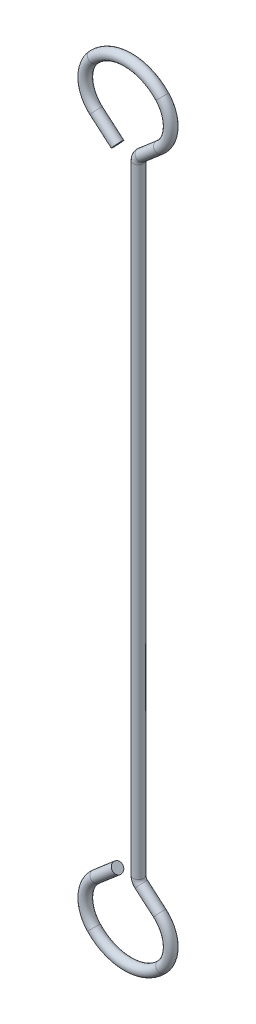
ISO-10303-21;
HEADER;
FILE_DESCRIPTION(('STEP AP214'),'2;1');
FILE_NAME('part.step','',(''),(''),'','','');
FILE_SCHEMA(('AUTOMOTIVE_DESIGN { 1 0 10303 214 1 1 1 1 }'));
ENDSEC;
DATA;
#1=APPLICATION_CONTEXT('core data for automotive mechanical design processes');
#2=APPLICATION_PROTOCOL_DEFINITION('international standard','automotive_design',2000,#1);
#3=PRODUCT_CONTEXT('',#1,'mechanical');
#4=PRODUCT('Part','Part','',(#3));
#5=PRODUCT_RELATED_PRODUCT_CATEGORY('part','',(#4));
#6=PRODUCT_DEFINITION_FORMATION('','',#4);
#7=PRODUCT_DEFINITION_CONTEXT('part definition',#1,'design');
#8=PRODUCT_DEFINITION('design','',#6,#7);
#9=PRODUCT_DEFINITION_SHAPE('','',#8);
#10=(LENGTH_UNIT() NAMED_UNIT(*) SI_UNIT(.MILLI.,.METRE.));
#11=(NAMED_UNIT(*) PLANE_ANGLE_UNIT() SI_UNIT($,.RADIAN.));
#12=(NAMED_UNIT(*) SI_UNIT($,.STERADIAN.) SOLID_ANGLE_UNIT());
#13=UNCERTAINTY_MEASURE_WITH_UNIT(LENGTH_MEASURE(1.E-05),#10,'distance_accuracy_value','');
#14=(GEOMETRIC_REPRESENTATION_CONTEXT(3) GLOBAL_UNCERTAINTY_ASSIGNED_CONTEXT((#13)) GLOBAL_UNIT_ASSIGNED_CONTEXT((#10,
#11,#12)) REPRESENTATION_CONTEXT('',''));
#15=CARTESIAN_POINT('',(0.,0.,0.));
#16=DIRECTION('',(0.,0.,1.));
#17=DIRECTION('',(1.,0.,0.));
#18=AXIS2_PLACEMENT_3D('',#15,#16,#17);
#19=CARTESIAN_POINT('',(-0.499999999999999,7.5,0.));
#20=DIRECTION('',(0.759256602365294,-0.650791373455971,0.));
#21=DIRECTION('',(0.650791373455971,0.759256602365294,0.));
#22=AXIS2_PLACEMENT_3D('',#19,#20,#21);
#23=PLANE('',#22);
#24=CARTESIAN_POINT('',(-0.499999999999999,7.5,0.));
#25=DIRECTION('',(0.759256602365294,-0.650791373455971,0.));
#26=DIRECTION('',(0.650791373455971,0.759256602365294,0.));
#27=AXIS2_PLACEMENT_3D('',#24,#25,#26);
#28=CIRCLE('',#27,0.125);
#29=CARTESIAN_POINT('',(-0.418651078318002,7.59490707529566,0.));
#30=VERTEX_POINT('',#29);
#31=EDGE_CURVE('E95',#30,#30,#28,.T.);
#32=ORIENTED_EDGE('',*,*,#31,.T.);
#33=EDGE_LOOP('',(#32));
#34=FACE_BOUND('',#33,.T.);
#35=ADVANCED_FACE('F49',(#34),#23,.T.);
#36=CARTESIAN_POINT('',(-0.499999999999998,-7.5,0.));
#37=DIRECTION('',(-0.759256602365298,-0.650791373455967,0.));
#38=DIRECTION('',(0.650791373455967,-0.759256602365298,0.));
#39=AXIS2_PLACEMENT_3D('',#36,#37,#38);
#40=PLANE('',#39);
#41=CARTESIAN_POINT('',(-0.499999999999998,-7.5,0.));
#42=DIRECTION('',(-0.759256602365298,-0.650791373455967,0.));
#43=DIRECTION('',(0.650791373455967,-0.759256602365298,0.));
#44=AXIS2_PLACEMENT_3D('',#41,#42,#43);
#45=CIRCLE('',#44,0.125);
#46=CARTESIAN_POINT('',(-0.418651078318002,-7.59490707529566,0.));
#47=VERTEX_POINT('',#46);
#48=EDGE_CURVE('E11',#47,#47,#45,.T.);
#49=ORIENTED_EDGE('',*,*,#48,.F.);
#50=EDGE_LOOP('',(#49));
#51=FACE_BOUND('',#50,.T.);
#52=ADVANCED_FACE('F103',(#51),#40,.F.);
#53=CARTESIAN_POINT('',(-0.499999999999999,7.5,0.));
#54=DIRECTION('',(-0.759256602365296,0.650791373455969,0.));
#55=DIRECTION('',(-0.650791373455969,-0.759256602365296,0.));
#56=AXIS2_PLACEMENT_3D('',#53,#54,#55);
#57=CYLINDRICAL_SURFACE('',#56,0.125);
#58=CARTESIAN_POINT('',(-1.0108687249912,7.93788747856389,0.));
#59=DIRECTION('',(0.759256602365294,-0.650791373455971,0.));
#60=DIRECTION('',(0.650791373455971,0.759256602365294,0.));
#61=AXIS2_PLACEMENT_3D('',#58,#59,#60);
#62=CIRCLE('',#61,0.125);
#63=CARTESIAN_POINT('',(-1.0922176466732,7.84298040326823,0.));
#64=VERTEX_POINT('',#63);
#65=EDGE_CURVE('E92',#64,#64,#62,.T.);
#66=ORIENTED_EDGE('',*,*,#65,.T.);
#67=EDGE_LOOP('',(#66));
#68=FACE_BOUND('',#67,.T.);
#69=ORIENTED_EDGE('',*,*,#31,.F.);
#70=EDGE_LOOP('',(#69));
#71=FACE_BOUND('',#70,.T.);
#72=ADVANCED_FACE('F100',(#68,#71),#57,.T.);
#73=CARTESIAN_POINT('',(-0.522775194899227,8.50732993033786,0.));
#74=DIRECTION('',(0.,0.,-1.));
#75=DIRECTION('',(-1.,0.,0.));
#76=AXIS2_PLACEMENT_3D('',#73,#74,#75);
#77=TOROIDAL_SURFACE('',#76,0.749999999999999,0.125);
#78=CARTESIAN_POINT('',(-1.06832558469768,9.02198979101358,0.));
#79=DIRECTION('',(-0.686213147567634,-0.72740051973127,0.));
#80=DIRECTION('',(0.72740051973127,-0.686213147567634,0.));
#81=AXIS2_PLACEMENT_3D('',#78,#79,#80);
#82=CIRCLE('',#81,0.125);
#83=CARTESIAN_POINT('',(-1.15925064966409,9.10776643445954,0.));
#84=VERTEX_POINT('',#83);
#85=EDGE_CURVE('E89',#84,#84,#82,.T.);
#86=CARTESIAN_POINT('',(-0.522775194899227,8.50732993033786,0.));
#87=DIRECTION('',(0.,0.,-1.));
#88=DIRECTION('',(-1.,0.,0.));
#89=AXIS2_PLACEMENT_3D('',#86,#87,#88);
#90=CIRCLE('',#89,0.874999999999999);
#91=EDGE_CURVE('',#64,#84,#90,.T.);
#92=ORIENTED_EDGE('',*,*,#65,.F.);
#93=ORIENTED_EDGE('',*,*,#85,.T.);
#94=ORIENTED_EDGE('',*,*,#91,.T.);
#95=ORIENTED_EDGE('',*,*,#91,.F.);
#96=EDGE_LOOP('',(#92,#94,#93,#95));
#97=FACE_BOUND('',#96,.T.);
#98=ADVANCED_FACE('F102',(#97),#77,.T.);
#99=CARTESIAN_POINT('',(-0.25,8.25,0.));
#100=DIRECTION('',(0.,0.,-1.));
#101=DIRECTION('',(-1.,0.,0.));
#102=AXIS2_PLACEMENT_3D('',#99,#100,#101);
#103=TOROIDAL_SURFACE('',#102,1.125,0.125);
#104=CARTESIAN_POINT('',(0.56832558469768,9.02198979101358,0.));
#105=DIRECTION('',(-0.686213147567629,0.727400519731275,0.));
#106=DIRECTION('',(-0.727400519731275,-0.686213147567629,0.));
#107=AXIS2_PLACEMENT_3D('',#104,#105,#106);
#108=CIRCLE('',#107,0.125);
#109=CARTESIAN_POINT('',(0.659250649664088,9.10776643445954,0.));
#110=VERTEX_POINT('',#109);
#111=EDGE_CURVE('E86',#110,#110,#108,.T.);
#112=CARTESIAN_POINT('',(-0.25,8.25,0.));
#113=DIRECTION('',(0.,0.,-1.));
#114=DIRECTION('',(-1.,0.,0.));
#115=AXIS2_PLACEMENT_3D('',#112,#113,#114);
#116=CIRCLE('',#115,1.25);
#117=EDGE_CURVE('',#84,#110,#116,.T.);
#118=ORIENTED_EDGE('',*,*,#85,.F.);
#119=ORIENTED_EDGE('',*,*,#111,.T.);
#120=ORIENTED_EDGE('',*,*,#117,.T.);
#121=ORIENTED_EDGE('',*,*,#117,.F.);
#122=EDGE_LOOP('',(#118,#120,#119,#121));
#123=FACE_BOUND('',#122,.T.);
#124=ADVANCED_FACE('F110',(#123),#103,.T.);
#125=CARTESIAN_POINT('',(0.0227751948992271,8.50732993033786,0.));
#126=DIRECTION('',(0.,0.,-1.));
#127=DIRECTION('',(-1.,0.,0.));
#128=AXIS2_PLACEMENT_3D('',#125,#126,#127);
#129=TOROIDAL_SURFACE('',#128,0.750000000000001,0.125);
#130=CARTESIAN_POINT('',(0.510868724991205,7.93788747856389,0.));
#131=DIRECTION('',(0.759256602365298,0.650791373455967,0.));
#132=DIRECTION('',(-0.650791373455967,0.759256602365298,0.));
#133=AXIS2_PLACEMENT_3D('',#130,#131,#132);
#134=CIRCLE('',#133,0.125);
#135=CARTESIAN_POINT('',(0.592217646673201,7.84298040326823,0.));
#136=VERTEX_POINT('',#135);
#137=EDGE_CURVE('E83',#136,#136,#134,.T.);
#138=CARTESIAN_POINT('',(0.0227751948992271,8.50732993033786,0.));
#139=DIRECTION('',(0.,0.,-1.));
#140=DIRECTION('',(-1.,0.,0.));
#141=AXIS2_PLACEMENT_3D('',#138,#139,#140);
#142=CIRCLE('',#141,0.875000000000001);
#143=EDGE_CURVE('',#110,#136,#142,.T.);
#144=ORIENTED_EDGE('',*,*,#111,.F.);
#145=ORIENTED_EDGE('',*,*,#137,.T.);
#146=ORIENTED_EDGE('',*,*,#143,.T.);
#147=ORIENTED_EDGE('',*,*,#143,.F.);
#148=EDGE_LOOP('',(#144,#146,#145,#147));
#149=FACE_BOUND('',#148,.T.);
#150=ADVANCED_FACE('F151',(#149),#129,.T.);
#151=CARTESIAN_POINT('',(0.510868724991205,7.93788747856389,0.));
#152=DIRECTION('',(-0.759256602365297,-0.650791373455968,0.));
#153=DIRECTION('',(0.650791373455968,-0.759256602365297,0.));
#154=AXIS2_PLACEMENT_3D('',#151,#152,#153);
#155=CYLINDRICAL_SURFACE('',#154,0.125);
#156=CARTESIAN_POINT('',(0.0698417253088063,7.55986433597898,0.));
#157=DIRECTION('',(0.759256602365299,0.650791373455966,0.));
#158=DIRECTION('',(-0.650791373455966,0.759256602365299,0.));
#159=AXIS2_PLACEMENT_3D('',#156,#157,#158);
#160=CIRCLE('',#159,0.125);
#161=CARTESIAN_POINT('',(-0.0115071963731886,7.65477141127464,0.));
#162=VERTEX_POINT('',#161);
#163=EDGE_CURVE('E80',#162,#162,#160,.T.);
#164=ORIENTED_EDGE('',*,*,#163,.T.);
#165=EDGE_LOOP('',(#164));
#166=FACE_BOUND('',#165,.T.);
#167=ORIENTED_EDGE('',*,*,#137,.F.);
#168=EDGE_LOOP('',(#167));
#169=FACE_BOUND('',#168,.T.);
#170=ADVANCED_FACE('F147',(#166,#169),#155,.T.);
#171=CARTESIAN_POINT('',(0.2,7.40801301550592,0.));
#172=DIRECTION('',(0.,0.,1.));
#173=DIRECTION('',(1.,0.,0.));
#174=AXIS2_PLACEMENT_3D('',#171,#172,#173);
#175=TOROIDAL_SURFACE('',#174,0.200000000000002,0.125);
#176=CARTESIAN_POINT('',(0.,7.40801301550592,0.));
#177=DIRECTION('',(0.,1.,0.));
#178=DIRECTION('',(-1.,0.,0.));
#179=AXIS2_PLACEMENT_3D('',#176,#177,#178);
#180=CIRCLE('',#179,0.125);
#181=CARTESIAN_POINT('',(-0.125000000000002,7.40801301550592,0.));
#182=VERTEX_POINT('',#181);
#183=EDGE_CURVE('E77',#182,#182,#180,.T.);
#184=CARTESIAN_POINT('',(0.2,7.40801301550592,0.));
#185=DIRECTION('',(0.,0.,1.));
#186=DIRECTION('',(1.,0.,0.));
#187=AXIS2_PLACEMENT_3D('',#184,#185,#186);
#188=CIRCLE('',#187,0.325000000000002);
#189=EDGE_CURVE('',#162,#182,#188,.T.);
#190=ORIENTED_EDGE('',*,*,#163,.F.);
#191=ORIENTED_EDGE('',*,*,#183,.T.);
#192=ORIENTED_EDGE('',*,*,#189,.T.);
#193=ORIENTED_EDGE('',*,*,#189,.F.);
#194=EDGE_LOOP('',(#190,#192,#191,#193));
#195=FACE_BOUND('',#194,.T.);
#196=ADVANCED_FACE('F143',(#195),#175,.T.);
#197=CARTESIAN_POINT('',(0.,7.40801301550592,0.));
#198=DIRECTION('',(0.,-1.,0.));
#199=DIRECTION('',(1.,0.,0.));
#200=AXIS2_PLACEMENT_3D('',#197,#198,#199);
#201=CYLINDRICAL_SURFACE('',#200,0.125);
#202=CARTESIAN_POINT('',(0.,-7.40801301550592,0.));
#203=DIRECTION('',(0.,1.,0.));
#204=DIRECTION('',(-1.,0.,0.));
#205=AXIS2_PLACEMENT_3D('',#202,#203,#204);
#206=CIRCLE('',#205,0.125);
#207=CARTESIAN_POINT('',(-0.125,-7.40801301550592,0.));
#208=VERTEX_POINT('',#207);
#209=EDGE_CURVE('E74',#208,#208,#206,.T.);
#210=ORIENTED_EDGE('',*,*,#209,.T.);
#211=EDGE_LOOP('',(#210));
#212=FACE_BOUND('',#211,.T.);
#213=ORIENTED_EDGE('',*,*,#183,.F.);
#214=EDGE_LOOP('',(#213));
#215=FACE_BOUND('',#214,.T.);
#216=ADVANCED_FACE('F139',(#212,#215),#201,.T.);
#217=CARTESIAN_POINT('',(0.200000000000002,-7.40801301550592,0.));
#218=DIRECTION('',(0.,0.,1.));
#219=DIRECTION('',(1.,0.,0.));
#220=AXIS2_PLACEMENT_3D('',#217,#218,#219);
#221=TOROIDAL_SURFACE('',#220,0.200000000000002,0.125);
#222=CARTESIAN_POINT('',(0.0698417253088054,-7.55986433597898,0.));
#223=DIRECTION('',(-0.759256602365293,0.650791373455973,0.));
#224=DIRECTION('',(-0.650791373455974,-0.759256602365293,0.));
#225=AXIS2_PLACEMENT_3D('',#222,#223,#224);
#226=CIRCLE('',#225,0.125);
#227=CARTESIAN_POINT('',(-0.0115071963731918,-7.65477141127464,0.));
#228=VERTEX_POINT('',#227);
#229=EDGE_CURVE('E71',#228,#228,#226,.T.);
#230=CARTESIAN_POINT('',(0.200000000000002,-7.40801301550592,0.));
#231=DIRECTION('',(0.,0.,1.));
#232=DIRECTION('',(1.,0.,0.));
#233=AXIS2_PLACEMENT_3D('',#230,#231,#232);
#234=CIRCLE('',#233,0.325000000000002);
#235=EDGE_CURVE('',#208,#228,#234,.T.);
#236=ORIENTED_EDGE('',*,*,#209,.F.);
#237=ORIENTED_EDGE('',*,*,#229,.T.);
#238=ORIENTED_EDGE('',*,*,#235,.T.);
#239=ORIENTED_EDGE('',*,*,#235,.F.);
#240=EDGE_LOOP('',(#236,#238,#237,#239));
#241=FACE_BOUND('',#240,.T.);
#242=ADVANCED_FACE('F135',(#241),#221,.T.);
#243=CARTESIAN_POINT('',(0.0698417253088045,-7.55986433597898,0.));
#244=DIRECTION('',(0.759256602365297,-0.650791373455968,0.));
#245=DIRECTION('',(0.650791373455968,0.759256602365297,0.));
#246=AXIS2_PLACEMENT_3D('',#243,#244,#245);
#247=CYLINDRICAL_SURFACE('',#246,0.125);
#248=CARTESIAN_POINT('',(0.510868724991203,-7.93788747856389,0.));
#249=DIRECTION('',(-0.759256602365295,0.65079137345597,0.));
#250=DIRECTION('',(-0.65079137345597,-0.759256602365295,0.));
#251=AXIS2_PLACEMENT_3D('',#248,#249,#250);
#252=CIRCLE('',#251,0.125);
#253=CARTESIAN_POINT('',(0.592217646673199,-7.84298040326823,0.));
#254=VERTEX_POINT('',#253);
#255=EDGE_CURVE('E68',#254,#254,#252,.T.);
#256=ORIENTED_EDGE('',*,*,#255,.T.);
#257=EDGE_LOOP('',(#256));
#258=FACE_BOUND('',#257,.T.);
#259=ORIENTED_EDGE('',*,*,#229,.F.);
#260=EDGE_LOOP('',(#259));
#261=FACE_BOUND('',#260,.T.);
#262=ADVANCED_FACE('F131',(#258,#261),#247,.T.);
#263=CARTESIAN_POINT('',(0.0227751948992292,-8.50732993033786,0.));
#264=DIRECTION('',(0.,0.,-1.));
#265=DIRECTION('',(-1.,0.,0.));
#266=AXIS2_PLACEMENT_3D('',#263,#264,#265);
#267=TOROIDAL_SURFACE('',#266,0.749999999999999,0.125);
#268=CARTESIAN_POINT('',(0.568325584697684,-9.02198979101358,0.));
#269=DIRECTION('',(0.686213147567634,0.72740051973127,0.));
#270=DIRECTION('',(-0.72740051973127,0.686213147567634,0.));
#271=AXIS2_PLACEMENT_3D('',#268,#269,#270);
#272=CIRCLE('',#271,0.125);
#273=CARTESIAN_POINT('',(0.659250649664094,-9.10776643445954,0.));
#274=VERTEX_POINT('',#273);
#275=EDGE_CURVE('E63',#274,#274,#272,.T.);
#276=CARTESIAN_POINT('',(0.0227751948992292,-8.50732993033786,0.));
#277=DIRECTION('',(0.,0.,-1.));
#278=DIRECTION('',(-1.,0.,0.));
#279=AXIS2_PLACEMENT_3D('',#276,#277,#278);
#280=CIRCLE('',#279,0.874999999999999);
#281=EDGE_CURVE('',#254,#274,#280,.T.);
#282=ORIENTED_EDGE('',*,*,#255,.F.);
#283=ORIENTED_EDGE('',*,*,#275,.T.);
#284=ORIENTED_EDGE('',*,*,#281,.T.);
#285=ORIENTED_EDGE('',*,*,#281,.F.);
#286=EDGE_LOOP('',(#282,#284,#283,#285));
#287=FACE_BOUND('',#286,.T.);
#288=ADVANCED_FACE('F127',(#287),#267,.T.);
#289=CARTESIAN_POINT('',(-0.249999999999998,-8.25,0.));
#290=DIRECTION('',(0.,0.,-1.));
#291=DIRECTION('',(-1.,0.,0.));
#292=AXIS2_PLACEMENT_3D('',#289,#290,#291);
#293=TOROIDAL_SURFACE('',#292,1.125,0.125);
#294=CARTESIAN_POINT('',(-1.06832558469768,-9.02198979101358,0.));
#295=DIRECTION('',(0.686213147567629,-0.727400519731275,0.));
#296=DIRECTION('',(0.727400519731275,0.686213147567629,0.));
#297=AXIS2_PLACEMENT_3D('',#294,#295,#296);
#298=CIRCLE('',#297,0.125);
#299=CARTESIAN_POINT('',(-1.15925064966409,-9.10776643445954,0.));
#300=VERTEX_POINT('',#299);
#301=EDGE_CURVE('E59',#300,#300,#298,.T.);
#302=CARTESIAN_POINT('',(-0.249999999999998,-8.25,0.));
#303=DIRECTION('',(0.,0.,-1.));
#304=DIRECTION('',(-1.,0.,0.));
#305=AXIS2_PLACEMENT_3D('',#302,#303,#304);
#306=CIRCLE('',#305,1.25);
#307=EDGE_CURVE('',#274,#300,#306,.T.);
#308=ORIENTED_EDGE('',*,*,#275,.F.);
#309=ORIENTED_EDGE('',*,*,#301,.T.);
#310=ORIENTED_EDGE('',*,*,#307,.T.);
#311=ORIENTED_EDGE('',*,*,#307,.F.);
#312=EDGE_LOOP('',(#308,#310,#309,#311));
#313=FACE_BOUND('',#312,.T.);
#314=ADVANCED_FACE('F121',(#313),#293,.T.);
#315=CARTESIAN_POINT('',(-0.522775194899225,-8.50732993033786,0.));
#316=DIRECTION('',(0.,0.,-1.));
#317=DIRECTION('',(-1.,0.,0.));
#318=AXIS2_PLACEMENT_3D('',#315,#316,#317);
#319=TOROIDAL_SURFACE('',#318,0.750000000000001,0.125);
#320=CARTESIAN_POINT('',(-1.01086872499121,-7.93788747856389,0.));
#321=DIRECTION('',(-0.759256602365298,-0.650791373455967,0.));
#322=DIRECTION('',(0.650791373455967,-0.759256602365298,0.));
#323=AXIS2_PLACEMENT_3D('',#320,#321,#322);
#324=CIRCLE('',#323,0.125);
#325=CARTESIAN_POINT('',(-1.0922176466732,-7.84298040326823,0.));
#326=VERTEX_POINT('',#325);
#327=EDGE_CURVE('E55',#326,#326,#324,.T.);
#328=CARTESIAN_POINT('',(-0.522775194899225,-8.50732993033786,0.));
#329=DIRECTION('',(0.,0.,-1.));
#330=DIRECTION('',(-1.,0.,0.));
#331=AXIS2_PLACEMENT_3D('',#328,#329,#330);
#332=CIRCLE('',#331,0.875000000000001);
#333=EDGE_CURVE('',#300,#326,#332,.T.);
#334=ORIENTED_EDGE('',*,*,#301,.F.);
#335=ORIENTED_EDGE('',*,*,#327,.T.);
#336=ORIENTED_EDGE('',*,*,#333,.T.);
#337=ORIENTED_EDGE('',*,*,#333,.F.);
#338=EDGE_LOOP('',(#334,#336,#335,#337));
#339=FACE_BOUND('',#338,.T.);
#340=ADVANCED_FACE('F116',(#339),#319,.T.);
#341=CARTESIAN_POINT('',(-1.0108687249912,-7.93788747856389,0.));
#342=DIRECTION('',(0.759256602365296,0.650791373455969,0.));
#343=DIRECTION('',(-0.650791373455969,0.759256602365296,0.));
#344=AXIS2_PLACEMENT_3D('',#341,#342,#343);
#345=CYLINDRICAL_SURFACE('',#344,0.125);
#346=ORIENTED_EDGE('',*,*,#48,.T.);
#347=EDGE_LOOP('',(#346));
#348=FACE_BOUND('',#347,.T.);
#349=ORIENTED_EDGE('',*,*,#327,.F.);
#350=EDGE_LOOP('',(#349));
#351=FACE_BOUND('',#350,.T.);
#352=ADVANCED_FACE('F114',(#348,#351),#345,.T.);
#353=CLOSED_SHELL('',(#35,#52,#72,#98,#124,#150,#170,#196,#216,#242,#262,#288,#314,#340,#352));
#354=MANIFOLD_SOLID_BREP('B2',#353);
#355=ADVANCED_BREP_SHAPE_REPRESENTATION('',(#18,#354),#14);
#356=SHAPE_DEFINITION_REPRESENTATION(#9,#355);
ENDSEC;
END-ISO-10303-21;
